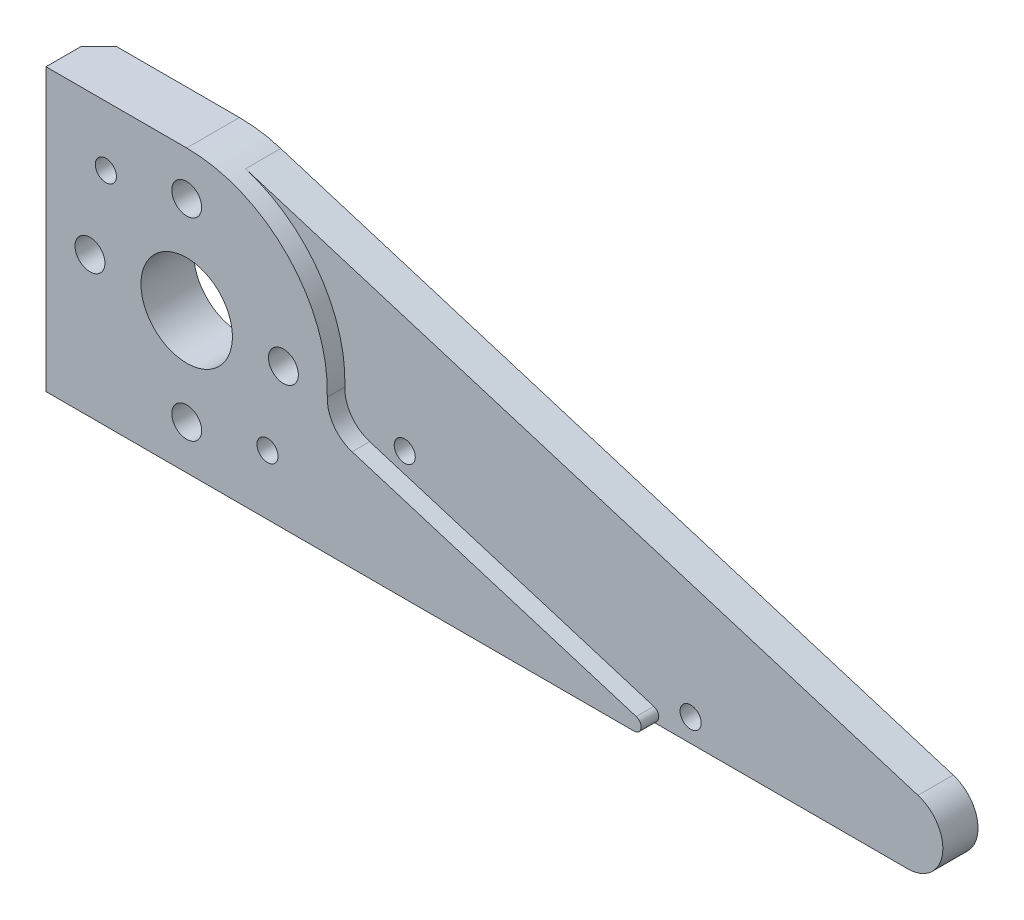
ISO-10303-21;
HEADER;
FILE_DESCRIPTION(('STEP AP214'),'2;1');
FILE_NAME('part.step','',(''),(''),'','','');
FILE_SCHEMA(('AUTOMOTIVE_DESIGN { 1 0 10303 214 1 1 1 1 }'));
ENDSEC;
DATA;
#1=APPLICATION_CONTEXT('core data for automotive mechanical design processes');
#2=APPLICATION_PROTOCOL_DEFINITION('international standard','automotive_design',2000,#1);
#3=PRODUCT_CONTEXT('',#1,'mechanical');
#4=PRODUCT('Part','Part','',(#3));
#5=PRODUCT_RELATED_PRODUCT_CATEGORY('part','',(#4));
#6=PRODUCT_DEFINITION_FORMATION('','',#4);
#7=PRODUCT_DEFINITION_CONTEXT('part definition',#1,'design');
#8=PRODUCT_DEFINITION('design','',#6,#7);
#9=PRODUCT_DEFINITION_SHAPE('','',#8);
#10=(LENGTH_UNIT() NAMED_UNIT(*) SI_UNIT(.MILLI.,.METRE.));
#11=(NAMED_UNIT(*) PLANE_ANGLE_UNIT() SI_UNIT($,.RADIAN.));
#12=(NAMED_UNIT(*) SI_UNIT($,.STERADIAN.) SOLID_ANGLE_UNIT());
#13=UNCERTAINTY_MEASURE_WITH_UNIT(LENGTH_MEASURE(1.E-05),#10,'distance_accuracy_value','');
#14=(GEOMETRIC_REPRESENTATION_CONTEXT(3) GLOBAL_UNCERTAINTY_ASSIGNED_CONTEXT((#13)) GLOBAL_UNIT_ASSIGNED_CONTEXT((#10,
#11,#12)) REPRESENTATION_CONTEXT('',''));
#15=CARTESIAN_POINT('',(0.,0.,0.));
#16=DIRECTION('',(0.,0.,1.));
#17=DIRECTION('',(1.,0.,0.));
#18=AXIS2_PLACEMENT_3D('',#15,#16,#17);
#19=CARTESIAN_POINT('',(200.,-30.,0.));
#20=DIRECTION('',(0.,0.,1.));
#21=DIRECTION('',(1.,0.,0.));
#22=AXIS2_PLACEMENT_3D('',#19,#20,#21);
#23=CYLINDRICAL_SURFACE('',#22,9.99999999999999);
#24=DIRECTION('',(0.,0.,1.));
#25=VECTOR('',#24,1.);
#26=CARTESIAN_POINT('',(202.933985330073,-20.440097799511,0.));
#27=LINE('',#26,#25);
#28=CARTESIAN_POINT('',(202.933985330073,-20.440097799511,0.));
#29=VERTEX_POINT('',#28);
#30=CARTESIAN_POINT('',(202.933985330073,-20.440097799511,10.));
#31=VERTEX_POINT('',#30);
#32=EDGE_CURVE('E143',#29,#31,#27,.T.);
#33=ORIENTED_EDGE('',*,*,#32,.T.);
#34=CARTESIAN_POINT('',(200.,-30.,10.));
#35=DIRECTION('',(0.,0.,1.));
#36=DIRECTION('',(1.,0.,0.));
#37=AXIS2_PLACEMENT_3D('',#34,#35,#36);
#38=CIRCLE('',#37,9.99999999999999);
#39=CARTESIAN_POINT('',(200.,-40.,10.));
#40=VERTEX_POINT('',#39);
#41=EDGE_CURVE('E135',#40,#31,#38,.T.);
#42=ORIENTED_EDGE('',*,*,#41,.F.);
#43=DIRECTION('',(0.,0.,1.));
#44=VECTOR('',#43,1.);
#45=CARTESIAN_POINT('',(200.,-40.,0.));
#46=LINE('',#45,#44);
#47=CARTESIAN_POINT('',(200.,-40.,0.));
#48=VERTEX_POINT('',#47);
#49=EDGE_CURVE('E142',#48,#40,#46,.T.);
#50=ORIENTED_EDGE('',*,*,#49,.F.);
#51=CARTESIAN_POINT('',(200.,-30.,0.));
#52=DIRECTION('',(0.,0.,1.));
#53=DIRECTION('',(1.,0.,0.));
#54=AXIS2_PLACEMENT_3D('',#51,#52,#53);
#55=CIRCLE('',#54,9.99999999999999);
#56=EDGE_CURVE('E299',#48,#29,#55,.T.);
#57=ORIENTED_EDGE('',*,*,#56,.T.);
#58=EDGE_LOOP('',(#33,#42,#50,#57));
#59=FACE_BOUND('',#58,.T.);
#60=ADVANCED_FACE('F34',(#59),#23,.T.);
#61=CARTESIAN_POINT('',(11.7359413202934,38.239608801956,0.));
#62=DIRECTION('',(0.293398533007335,0.9559902200489,0.));
#63=DIRECTION('',(-0.9559902200489,0.293398533007335,0.));
#64=AXIS2_PLACEMENT_3D('',#61,#62,#63);
#65=PLANE('',#64);
#66=DIRECTION('',(0.,0.,1.));
#67=VECTOR('',#66,1.);
#68=CARTESIAN_POINT('',(11.7359413202934,38.239608801956,0.));
#69=LINE('',#68,#67);
#70=CARTESIAN_POINT('',(11.7359413202934,38.239608801956,0.));
#71=VERTEX_POINT('',#70);
#72=CARTESIAN_POINT('',(11.7359413202934,38.239608801956,10.));
#73=VERTEX_POINT('',#72);
#74=EDGE_CURVE('E122',#71,#73,#69,.T.);
#75=ORIENTED_EDGE('',*,*,#74,.T.);
#76=DIRECTION('',(-0.9559902200489,0.293398533007335,0.));
#77=VECTOR('',#76,1.);
#78=CARTESIAN_POINT('',(11.7359413202934,38.239608801956,10.));
#79=LINE('',#78,#77);
#80=EDGE_CURVE('E130',#31,#73,#79,.T.);
#81=ORIENTED_EDGE('',*,*,#80,.F.);
#82=ORIENTED_EDGE('',*,*,#32,.F.);
#83=DIRECTION('',(-0.9559902200489,0.293398533007335,0.));
#84=VECTOR('',#83,1.);
#85=CARTESIAN_POINT('',(11.7359413202934,38.239608801956,0.));
#86=LINE('',#85,#84);
#87=EDGE_CURVE('E141',#29,#71,#86,.T.);
#88=ORIENTED_EDGE('',*,*,#87,.T.);
#89=EDGE_LOOP('',(#75,#81,#82,#88));
#90=FACE_BOUND('',#89,.T.);
#91=ADVANCED_FACE('F139',(#90),#65,.T.);
#92=CARTESIAN_POINT('',(0.,-27.4999999999983,20.));
#93=DIRECTION('',(0.,0.,-1.));
#94=DIRECTION('',(-1.,0.,0.));
#95=AXIS2_PLACEMENT_3D('',#92,#93,#94);
#96=CYLINDRICAL_SURFACE('',#95,2.49999999999872);
#97=CARTESIAN_POINT('',(0.,-27.4999999999983,0.));
#98=DIRECTION('',(0.,0.,-1.));
#99=DIRECTION('',(-1.,0.,0.));
#100=AXIS2_PLACEMENT_3D('',#97,#98,#99);
#101=CIRCLE('',#100,2.49999999999872);
#102=CARTESIAN_POINT('',(-2.49999999999873,-27.4999999999983,0.));
#103=VERTEX_POINT('',#102);
#104=EDGE_CURVE('E184',#103,#103,#101,.T.);
#105=ORIENTED_EDGE('',*,*,#104,.T.);
#106=EDGE_LOOP('',(#105));
#107=FACE_BOUND('',#106,.T.);
#108=CARTESIAN_POINT('',(0.,-27.4999999999983,9.));
#109=DIRECTION('',(0.,0.,1.));
#110=DIRECTION('',(1.,0.,0.));
#111=AXIS2_PLACEMENT_3D('',#108,#109,#110);
#112=CIRCLE('',#111,2.49999999999872);
#113=CARTESIAN_POINT('',(2.49999999999872,-27.4999999999983,9.));
#114=VERTEX_POINT('',#113);
#115=EDGE_CURVE('E154',#114,#114,#112,.F.);
#116=ORIENTED_EDGE('',*,*,#115,.F.);
#117=EDGE_LOOP('',(#116));
#118=FACE_BOUND('',#117,.T.);
#119=ADVANCED_FACE('F337',(#107,#118),#96,.F.);
#120=CARTESIAN_POINT('',(27.4999999999983,0.,20.));
#121=DIRECTION('',(0.,0.,-1.));
#122=DIRECTION('',(-1.,0.,0.));
#123=AXIS2_PLACEMENT_3D('',#120,#121,#122);
#124=CYLINDRICAL_SURFACE('',#123,2.49999999999705);
#125=CARTESIAN_POINT('',(27.4999999999983,0.,0.));
#126=DIRECTION('',(0.,0.,-1.));
#127=DIRECTION('',(-1.,0.,0.));
#128=AXIS2_PLACEMENT_3D('',#125,#126,#127);
#129=CIRCLE('',#128,2.49999999999705);
#130=CARTESIAN_POINT('',(25.0000000000013,0.,0.));
#131=VERTEX_POINT('',#130);
#132=EDGE_CURVE('E181',#131,#131,#129,.T.);
#133=ORIENTED_EDGE('',*,*,#132,.T.);
#134=EDGE_LOOP('',(#133));
#135=FACE_BOUND('',#134,.T.);
#136=CARTESIAN_POINT('',(27.4999999999983,0.,9.));
#137=DIRECTION('',(0.,0.,1.));
#138=DIRECTION('',(1.,0.,0.));
#139=AXIS2_PLACEMENT_3D('',#136,#137,#138);
#140=CIRCLE('',#139,2.49999999999705);
#141=CARTESIAN_POINT('',(29.9999999999954,0.,9.));
#142=VERTEX_POINT('',#141);
#143=EDGE_CURVE('E160',#142,#142,#140,.F.);
#144=ORIENTED_EDGE('',*,*,#143,.F.);
#145=EDGE_LOOP('',(#144));
#146=FACE_BOUND('',#145,.T.);
#147=ADVANCED_FACE('F380',(#135,#146),#124,.F.);
#148=CARTESIAN_POINT('',(-27.4999999999983,0.,20.));
#149=DIRECTION('',(0.,0.,-1.));
#150=DIRECTION('',(-1.,0.,0.));
#151=AXIS2_PLACEMENT_3D('',#148,#149,#150);
#152=CYLINDRICAL_SURFACE('',#151,2.49999999999999);
#153=CARTESIAN_POINT('',(-27.4999999999983,0.,0.));
#154=DIRECTION('',(0.,0.,-1.));
#155=DIRECTION('',(-1.,0.,0.));
#156=AXIS2_PLACEMENT_3D('',#153,#154,#155);
#157=CIRCLE('',#156,2.49999999999999);
#158=CARTESIAN_POINT('',(-29.9999999999983,0.,0.));
#159=VERTEX_POINT('',#158);
#160=EDGE_CURVE('E187',#159,#159,#157,.T.);
#161=ORIENTED_EDGE('',*,*,#160,.T.);
#162=EDGE_LOOP('',(#161));
#163=FACE_BOUND('',#162,.T.);
#164=CARTESIAN_POINT('',(-27.4999999999983,0.,9.));
#165=DIRECTION('',(0.,0.,1.));
#166=DIRECTION('',(1.,0.,0.));
#167=AXIS2_PLACEMENT_3D('',#164,#165,#166);
#168=CIRCLE('',#167,2.49999999999999);
#169=CARTESIAN_POINT('',(-24.9999999999983,0.,9.));
#170=VERTEX_POINT('',#169);
#171=EDGE_CURVE('E167',#170,#170,#168,.F.);
#172=ORIENTED_EDGE('',*,*,#171,.F.);
#173=EDGE_LOOP('',(#172));
#174=FACE_BOUND('',#173,.T.);
#175=ADVANCED_FACE('F378',(#163,#174),#152,.F.);
#176=CARTESIAN_POINT('',(2.18575157973078E-13,27.4999999999983,20.));
#177=DIRECTION('',(0.,0.,-1.));
#178=DIRECTION('',(-1.,0.,0.));
#179=AXIS2_PLACEMENT_3D('',#176,#177,#178);
#180=CYLINDRICAL_SURFACE('',#179,2.50000000000002);
#181=CARTESIAN_POINT('',(2.18575157973078E-13,27.4999999999983,0.));
#182=DIRECTION('',(0.,0.,-1.));
#183=DIRECTION('',(-1.,0.,0.));
#184=AXIS2_PLACEMENT_3D('',#181,#182,#183);
#185=CIRCLE('',#184,2.50000000000002);
#186=CARTESIAN_POINT('',(-2.4999999999998,27.4999999999983,0.));
#187=VERTEX_POINT('',#186);
#188=EDGE_CURVE('E178',#187,#187,#185,.T.);
#189=ORIENTED_EDGE('',*,*,#188,.T.);
#190=EDGE_LOOP('',(#189));
#191=FACE_BOUND('',#190,.T.);
#192=CARTESIAN_POINT('',(2.18575157973078E-13,27.4999999999983,9.));
#193=DIRECTION('',(0.,0.,1.));
#194=DIRECTION('',(1.,0.,0.));
#195=AXIS2_PLACEMENT_3D('',#192,#193,#194);
#196=CIRCLE('',#195,2.50000000000002);
#197=CARTESIAN_POINT('',(2.50000000000024,27.4999999999983,9.));
#198=VERTEX_POINT('',#197);
#199=EDGE_CURVE('E174',#198,#198,#196,.F.);
#200=ORIENTED_EDGE('',*,*,#199,.F.);
#201=EDGE_LOOP('',(#200));
#202=FACE_BOUND('',#201,.T.);
#203=ADVANCED_FACE('F375',(#191,#202),#180,.F.);
#204=CARTESIAN_POINT('',(0.,0.,0.));
#205=DIRECTION('',(0.,0.,1.));
#206=DIRECTION('',(1.,0.,0.));
#207=AXIS2_PLACEMENT_3D('',#204,#205,#206);
#208=PLANE('',#207);
#209=ORIENTED_EDGE('',*,*,#188,.F.);
#210=EDGE_LOOP('',(#209));
#211=FACE_BOUND('',#210,.T.);
#212=ORIENTED_EDGE('',*,*,#132,.F.);
#213=EDGE_LOOP('',(#212));
#214=FACE_BOUND('',#213,.T.);
#215=ORIENTED_EDGE('',*,*,#104,.F.);
#216=EDGE_LOOP('',(#215));
#217=FACE_BOUND('',#216,.T.);
#218=ORIENTED_EDGE('',*,*,#160,.F.);
#219=EDGE_LOOP('',(#218));
#220=FACE_BOUND('',#219,.T.);
#221=CARTESIAN_POINT('',(-22.9809703885628,22.9809703885628,0.));
#222=DIRECTION('',(0.,0.,1.));
#223=DIRECTION('',(1.,0.,0.));
#224=AXIS2_PLACEMENT_3D('',#221,#222,#223);
#225=CIRCLE('',#224,5.25);
#226=CARTESIAN_POINT('',(-17.7309703885628,22.9809703885628,0.));
#227=VERTEX_POINT('',#226);
#228=EDGE_CURVE('E201',#227,#227,#225,.T.);
#229=ORIENTED_EDGE('',*,*,#228,.T.);
#230=EDGE_LOOP('',(#229));
#231=FACE_BOUND('',#230,.T.);
#232=CARTESIAN_POINT('',(0.,0.,0.));
#233=DIRECTION('',(0.,0.,-1.));
#234=DIRECTION('',(-1.,0.,0.));
#235=AXIS2_PLACEMENT_3D('',#232,#233,#234);
#236=CIRCLE('',#235,13.);
#237=CARTESIAN_POINT('',(-13.,0.,0.));
#238=VERTEX_POINT('',#237);
#239=EDGE_CURVE('E210',#238,#238,#236,.T.);
#240=ORIENTED_EDGE('',*,*,#239,.F.);
#241=EDGE_LOOP('',(#240));
#242=FACE_BOUND('',#241,.T.);
#243=DIRECTION('',(1.,0.,0.));
#244=VECTOR('',#243,1.);
#245=CARTESIAN_POINT('',(-40.,-40.,0.));
#246=LINE('',#245,#244);
#247=CARTESIAN_POINT('',(-35.,-40.,0.));
#248=VERTEX_POINT('',#247);
#249=EDGE_CURVE('E214',#248,#48,#246,.T.);
#250=ORIENTED_EDGE('',*,*,#249,.F.);
#251=DIRECTION('',(0.,1.,0.));
#252=VECTOR('',#251,1.);
#253=CARTESIAN_POINT('',(-35.,0.,0.));
#254=LINE('',#253,#252);
#255=CARTESIAN_POINT('',(-35.,40.,0.));
#256=VERTEX_POINT('',#255);
#257=EDGE_CURVE('E246',#248,#256,#254,.T.);
#258=ORIENTED_EDGE('',*,*,#257,.T.);
#259=DIRECTION('',(-1.,0.,0.));
#260=VECTOR('',#259,1.);
#261=CARTESIAN_POINT('',(-40.,40.,0.));
#262=LINE('',#261,#260);
#263=CARTESIAN_POINT('',(0.,40.,0.));
#264=VERTEX_POINT('',#263);
#265=EDGE_CURVE('E221',#264,#256,#262,.T.);
#266=ORIENTED_EDGE('',*,*,#265,.F.);
#267=CARTESIAN_POINT('',(0.,0.,0.));
#268=DIRECTION('',(0.,0.,1.));
#269=DIRECTION('',(1.,0.,0.));
#270=AXIS2_PLACEMENT_3D('',#267,#268,#269);
#271=CIRCLE('',#270,40.);
#272=EDGE_CURVE('E229',#71,#264,#271,.T.);
#273=ORIENTED_EDGE('',*,*,#272,.F.);
#274=ORIENTED_EDGE('',*,*,#87,.F.);
#275=ORIENTED_EDGE('',*,*,#56,.F.);
#276=EDGE_LOOP('',(#250,#258,#266,#273,#274,#275));
#277=FACE_BOUND('',#276,.T.);
#278=CARTESIAN_POINT('',(22.9809703885627,-22.9809703885628,0.));
#279=DIRECTION('',(0.,0.,1.));
#280=DIRECTION('',(-1.,0.,0.));
#281=AXIS2_PLACEMENT_3D('',#278,#279,#280);
#282=CIRCLE('',#281,5.25);
#283=CARTESIAN_POINT('',(17.7309703885627,-22.9809703885628,0.));
#284=VERTEX_POINT('',#283);
#285=EDGE_CURVE('E190',#284,#284,#282,.T.);
#286=ORIENTED_EDGE('',*,*,#285,.T.);
#287=EDGE_LOOP('',(#286));
#288=FACE_BOUND('',#287,.T.);
#289=ADVANCED_FACE('F295',(#211,#214,#217,#220,#231,#242,#277,#288),#208,.F.);
#290=CARTESIAN_POINT('',(22.9809703885627,-22.9809703885628,-5.));
#291=DIRECTION('',(0.,0.,1.));
#292=DIRECTION('',(1.,0.,0.));
#293=AXIS2_PLACEMENT_3D('',#290,#291,#292);
#294=CYLINDRICAL_SURFACE('',#293,3.);
#295=CARTESIAN_POINT('',(22.9809703885627,-22.9809703885628,15.));
#296=DIRECTION('',(0.,0.,1.));
#297=DIRECTION('',(1.,0.,0.));
#298=AXIS2_PLACEMENT_3D('',#295,#296,#297);
#299=CIRCLE('',#298,3.);
#300=CARTESIAN_POINT('',(25.9809703885627,-22.9809703885628,15.));
#301=VERTEX_POINT('',#300);
#302=EDGE_CURVE('E204',#301,#301,#299,.T.);
#303=ORIENTED_EDGE('',*,*,#302,.T.);
#304=EDGE_LOOP('',(#303));
#305=FACE_BOUND('',#304,.T.);
#306=CARTESIAN_POINT('',(22.9809703885627,-22.9809703885628,8.5));
#307=DIRECTION('',(0.,0.,-1.));
#308=DIRECTION('',(-1.,0.,0.));
#309=AXIS2_PLACEMENT_3D('',#306,#307,#308);
#310=CIRCLE('',#309,3.);
#311=CARTESIAN_POINT('',(19.9809703885627,-22.9809703885628,8.5));
#312=VERTEX_POINT('',#311);
#313=EDGE_CURVE('E194',#312,#312,#310,.F.);
#314=ORIENTED_EDGE('',*,*,#313,.F.);
#315=EDGE_LOOP('',(#314));
#316=FACE_BOUND('',#315,.T.);
#317=ADVANCED_FACE('F406',(#305,#316),#294,.F.);
#318=CARTESIAN_POINT('',(-40.,40.,15.));
#319=DIRECTION('',(1.,0.,0.));
#320=DIRECTION('',(0.,1.,0.));
#321=AXIS2_PLACEMENT_3D('',#318,#319,#320);
#322=PLANE('',#321);
#323=DIRECTION('',(0.,0.,-1.));
#324=VECTOR('',#323,1.);
#325=CARTESIAN_POINT('',(-40.,40.,15.));
#326=LINE('',#325,#324);
#327=CARTESIAN_POINT('',(-40.,40.,15.));
#328=VERTEX_POINT('',#327);
#329=CARTESIAN_POINT('',(-40.,40.,4.99999999999999));
#330=VERTEX_POINT('',#329);
#331=EDGE_CURVE('E227',#328,#330,#326,.T.);
#332=ORIENTED_EDGE('',*,*,#331,.T.);
#333=DIRECTION('',(0.,-1.,0.));
#334=VECTOR('',#333,1.);
#335=CARTESIAN_POINT('',(-40.,40.,4.99999999999999));
#336=LINE('',#335,#334);
#337=CARTESIAN_POINT('',(-40.,-40.,4.99999999999999));
#338=VERTEX_POINT('',#337);
#339=EDGE_CURVE('E241',#330,#338,#336,.T.);
#340=ORIENTED_EDGE('',*,*,#339,.T.);
#341=DIRECTION('',(0.,0.,-1.));
#342=VECTOR('',#341,1.);
#343=CARTESIAN_POINT('',(-40.,-40.,15.));
#344=LINE('',#343,#342);
#345=CARTESIAN_POINT('',(-40.,-40.,15.));
#346=VERTEX_POINT('',#345);
#347=EDGE_CURVE('E238',#346,#338,#344,.T.);
#348=ORIENTED_EDGE('',*,*,#347,.F.);
#349=DIRECTION('',(0.,-1.,0.));
#350=VECTOR('',#349,1.);
#351=CARTESIAN_POINT('',(-40.,40.,15.));
#352=LINE('',#351,#350);
#353=EDGE_CURVE('E217',#328,#346,#352,.T.);
#354=ORIENTED_EDGE('',*,*,#353,.F.);
#355=EDGE_LOOP('',(#332,#340,#348,#354));
#356=FACE_BOUND('',#355,.T.);
#357=ADVANCED_FACE('F287',(#356),#322,.F.);
#358=CARTESIAN_POINT('',(-40.,-40.,15.));
#359=DIRECTION('',(0.,1.,0.));
#360=DIRECTION('',(0.,0.,1.));
#361=AXIS2_PLACEMENT_3D('',#358,#359,#360);
#362=PLANE('',#361);
#363=DIRECTION('',(1.,0.,0.));
#364=VECTOR('',#363,1.);
#365=CARTESIAN_POINT('',(140.558333333333,-40.,10.));
#366=LINE('',#365,#364);
#367=CARTESIAN_POINT('',(127.225,-40.,10.));
#368=VERTEX_POINT('',#367);
#369=EDGE_CURVE('E277',#368,#40,#366,.T.);
#370=ORIENTED_EDGE('',*,*,#369,.F.);
#371=DIRECTION('',(0.,0.,1.));
#372=VECTOR('',#371,1.);
#373=CARTESIAN_POINT('',(127.225,-40.,15.));
#374=LINE('',#373,#372);
#375=CARTESIAN_POINT('',(127.225,-40.,15.));
#376=VERTEX_POINT('',#375);
#377=EDGE_CURVE('E250',#368,#376,#374,.T.);
#378=ORIENTED_EDGE('',*,*,#377,.T.);
#379=DIRECTION('',(1.,0.,0.));
#380=VECTOR('',#379,1.);
#381=CARTESIAN_POINT('',(-40.,-40.,15.));
#382=LINE('',#381,#380);
#383=EDGE_CURVE('E220',#346,#376,#382,.T.);
#384=ORIENTED_EDGE('',*,*,#383,.F.);
#385=ORIENTED_EDGE('',*,*,#347,.T.);
#386=DIRECTION('',(-0.70710678118655,0.,0.707106781186546));
#387=VECTOR('',#386,1.);
#388=CARTESIAN_POINT('',(-40.,-40.,5.));
#389=LINE('',#388,#387);
#390=EDGE_CURVE('E244',#338,#248,#389,.F.);
#391=ORIENTED_EDGE('',*,*,#390,.T.);
#392=ORIENTED_EDGE('',*,*,#249,.T.);
#393=ORIENTED_EDGE('',*,*,#49,.T.);
#394=EDGE_LOOP('',(#370,#378,#384,#385,#391,#392,#393));
#395=FACE_BOUND('',#394,.T.);
#396=ADVANCED_FACE('F276',(#395),#362,.F.);
#397=CARTESIAN_POINT('',(0.,0.,15.));
#398=DIRECTION('',(0.,0.,-1.));
#399=DIRECTION('',(-1.,0.,0.));
#400=AXIS2_PLACEMENT_3D('',#397,#398,#399);
#401=CYLINDRICAL_SURFACE('',#400,40.);
#402=CARTESIAN_POINT('',(0.,0.,15.));
#403=DIRECTION('',(0.,0.,1.));
#404=DIRECTION('',(1.,0.,0.));
#405=AXIS2_PLACEMENT_3D('',#402,#403,#404);
#406=CIRCLE('',#405,40.);
#407=CARTESIAN_POINT('',(39.975840488905,-1.39002777153095,15.));
#408=VERTEX_POINT('',#407);
#409=CARTESIAN_POINT('',(0.,40.,15.));
#410=VERTEX_POINT('',#409);
#411=EDGE_CURVE('E223',#408,#410,#406,.T.);
#412=ORIENTED_EDGE('',*,*,#411,.F.);
#413=DIRECTION('',(0.,0.,1.));
#414=VECTOR('',#413,1.);
#415=CARTESIAN_POINT('',(39.975840488905,-1.39002777153095,10.));
#416=LINE('',#415,#414);
#417=CARTESIAN_POINT('',(39.975840488905,-1.39002777153095,10.));
#418=VERTEX_POINT('',#417);
#419=EDGE_CURVE('E125',#418,#408,#416,.T.);
#420=ORIENTED_EDGE('',*,*,#419,.F.);
#421=CARTESIAN_POINT('',(0.,0.,10.));
#422=DIRECTION('',(0.,0.,-1.));
#423=DIRECTION('',(1.,0.,0.));
#424=AXIS2_PLACEMENT_3D('',#421,#422,#423);
#425=CIRCLE('',#424,40.);
#426=EDGE_CURVE('E118',#73,#418,#425,.T.);
#427=ORIENTED_EDGE('',*,*,#426,.F.);
#428=ORIENTED_EDGE('',*,*,#74,.F.);
#429=ORIENTED_EDGE('',*,*,#272,.T.);
#430=DIRECTION('',(0.,0.,-1.));
#431=VECTOR('',#430,1.);
#432=CARTESIAN_POINT('',(0.,40.,15.));
#433=LINE('',#432,#431);
#434=EDGE_CURVE('E235',#410,#264,#433,.T.);
#435=ORIENTED_EDGE('',*,*,#434,.F.);
#436=EDGE_LOOP('',(#412,#420,#427,#428,#429,#435));
#437=FACE_BOUND('',#436,.T.);
#438=ADVANCED_FACE('F120',(#437),#401,.T.);
#439=CARTESIAN_POINT('',(-40.,40.,15.));
#440=DIRECTION('',(0.,-1.,0.));
#441=DIRECTION('',(1.,0.,0.));
#442=AXIS2_PLACEMENT_3D('',#439,#440,#441);
#443=PLANE('',#442);
#444=ORIENTED_EDGE('',*,*,#265,.T.);
#445=DIRECTION('',(0.70710678118655,0.,-0.707106781186546));
#446=VECTOR('',#445,1.);
#447=CARTESIAN_POINT('',(-40.,40.,4.99999999999999));
#448=LINE('',#447,#446);
#449=EDGE_CURVE('E248',#256,#330,#448,.F.);
#450=ORIENTED_EDGE('',*,*,#449,.T.);
#451=ORIENTED_EDGE('',*,*,#331,.F.);
#452=DIRECTION('',(-1.,0.,0.));
#453=VECTOR('',#452,1.);
#454=CARTESIAN_POINT('',(-40.,40.,15.));
#455=LINE('',#454,#453);
#456=EDGE_CURVE('E225',#410,#328,#455,.T.);
#457=ORIENTED_EDGE('',*,*,#456,.F.);
#458=ORIENTED_EDGE('',*,*,#434,.T.);
#459=EDGE_LOOP('',(#444,#450,#451,#457,#458));
#460=FACE_BOUND('',#459,.T.);
#461=ADVANCED_FACE('F303',(#460),#443,.F.);
#462=CARTESIAN_POINT('',(0.,0.,15.));
#463=DIRECTION('',(0.,0.,1.));
#464=DIRECTION('',(1.,0.,0.));
#465=AXIS2_PLACEMENT_3D('',#462,#463,#464);
#466=PLANE('',#465);
#467=ORIENTED_EDGE('',*,*,#383,.T.);
#468=CARTESIAN_POINT('',(127.225,-38.,15.));
#469=DIRECTION('',(0.,0.,1.));
#470=DIRECTION('',(1.,0.,0.));
#471=AXIS2_PLACEMENT_3D('',#468,#469,#470);
#472=CIRCLE('',#471,2.);
#473=CARTESIAN_POINT('',(127.811797066015,-36.0880195599022,15.));
#474=VERTEX_POINT('',#473);
#475=EDGE_CURVE('E56',#376,#474,#472,.T.);
#476=ORIENTED_EDGE('',*,*,#475,.T.);
#477=DIRECTION('',(0.9559902200489,-0.293398533007335,0.));
#478=VECTOR('',#477,1.);
#479=CARTESIAN_POINT('',(140.558333333333,-40.,15.));
#480=LINE('',#479,#478);
#481=CARTESIAN_POINT('',(47.0358152810579,-11.2974369149027,15.));
#482=VERTEX_POINT('',#481);
#483=EDGE_CURVE('E311',#482,#474,#480,.T.);
#484=ORIENTED_EDGE('',*,*,#483,.F.);
#485=CARTESIAN_POINT('',(49.9698006111312,-1.73753471441369,15.));
#486=DIRECTION('',(0.,0.,1.));
#487=DIRECTION('',(-1.,0.,0.));
#488=AXIS2_PLACEMENT_3D('',#485,#486,#487);
#489=CIRCLE('',#488,10.);
#490=EDGE_CURVE('E266',#408,#482,#489,.T.);
#491=ORIENTED_EDGE('',*,*,#490,.F.);
#492=ORIENTED_EDGE('',*,*,#411,.T.);
#493=ORIENTED_EDGE('',*,*,#456,.T.);
#494=ORIENTED_EDGE('',*,*,#353,.T.);
#495=EDGE_LOOP('',(#467,#476,#484,#491,#492,#493,#494));
#496=FACE_BOUND('',#495,.T.);
#497=CARTESIAN_POINT('',(0.,-27.4999999999983,15.));
#498=DIRECTION('',(0.,0.,1.));
#499=DIRECTION('',(1.,0.,0.));
#500=AXIS2_PLACEMENT_3D('',#497,#498,#499);
#501=CIRCLE('',#500,4.24999999999928);
#502=CARTESIAN_POINT('',(4.24999999999927,-27.4999999999983,15.));
#503=VERTEX_POINT('',#502);
#504=EDGE_CURVE('E146',#503,#503,#501,.T.);
#505=ORIENTED_EDGE('',*,*,#504,.F.);
#506=EDGE_LOOP('',(#505));
#507=FACE_BOUND('',#506,.T.);
#508=CARTESIAN_POINT('',(27.4999999999983,0.,15.));
#509=DIRECTION('',(0.,0.,1.));
#510=DIRECTION('',(1.,0.,0.));
#511=AXIS2_PLACEMENT_3D('',#508,#509,#510);
#512=CIRCLE('',#511,4.25000000000077);
#513=CARTESIAN_POINT('',(31.7499999999991,0.,15.));
#514=VERTEX_POINT('',#513);
#515=EDGE_CURVE('E161',#514,#514,#512,.T.);
#516=ORIENTED_EDGE('',*,*,#515,.F.);
#517=EDGE_LOOP('',(#516));
#518=FACE_BOUND('',#517,.T.);
#519=CARTESIAN_POINT('',(-27.4999999999983,0.,15.));
#520=DIRECTION('',(0.,0.,1.));
#521=DIRECTION('',(1.,0.,0.));
#522=AXIS2_PLACEMENT_3D('',#519,#520,#521);
#523=CIRCLE('',#522,4.24999999999899);
#524=CARTESIAN_POINT('',(-23.2499999999993,0.,15.));
#525=VERTEX_POINT('',#524);
#526=EDGE_CURVE('E168',#525,#525,#523,.T.);
#527=ORIENTED_EDGE('',*,*,#526,.F.);
#528=EDGE_LOOP('',(#527));
#529=FACE_BOUND('',#528,.T.);
#530=CARTESIAN_POINT('',(2.18681409785981E-13,27.4999999999983,15.));
#531=DIRECTION('',(0.,0.,1.));
#532=DIRECTION('',(1.,0.,0.));
#533=AXIS2_PLACEMENT_3D('',#530,#531,#532);
#534=CIRCLE('',#533,4.25);
#535=CARTESIAN_POINT('',(4.25000000000022,27.4999999999983,15.));
#536=VERTEX_POINT('',#535);
#537=EDGE_CURVE('E175',#536,#536,#534,.T.);
#538=ORIENTED_EDGE('',*,*,#537,.F.);
#539=EDGE_LOOP('',(#538));
#540=FACE_BOUND('',#539,.T.);
#541=ORIENTED_EDGE('',*,*,#302,.F.);
#542=EDGE_LOOP('',(#541));
#543=FACE_BOUND('',#542,.T.);
#544=CARTESIAN_POINT('',(-22.9809703885628,22.9809703885628,15.));
#545=DIRECTION('',(0.,0.,1.));
#546=DIRECTION('',(1.,0.,0.));
#547=AXIS2_PLACEMENT_3D('',#544,#545,#546);
#548=CIRCLE('',#547,3.);
#549=CARTESIAN_POINT('',(-19.9809703885628,22.9809703885628,15.));
#550=VERTEX_POINT('',#549);
#551=EDGE_CURVE('E207',#550,#550,#548,.T.);
#552=ORIENTED_EDGE('',*,*,#551,.F.);
#553=EDGE_LOOP('',(#552));
#554=FACE_BOUND('',#553,.T.);
#555=CARTESIAN_POINT('',(0.,0.,15.));
#556=DIRECTION('',(0.,0.,-1.));
#557=DIRECTION('',(-1.,0.,0.));
#558=AXIS2_PLACEMENT_3D('',#555,#556,#557);
#559=CIRCLE('',#558,13.);
#560=CARTESIAN_POINT('',(-13.,0.,15.));
#561=VERTEX_POINT('',#560);
#562=EDGE_CURVE('E211',#561,#561,#559,.T.);
#563=ORIENTED_EDGE('',*,*,#562,.T.);
#564=EDGE_LOOP('',(#563));
#565=FACE_BOUND('',#564,.T.);
#566=ADVANCED_FACE('F280',(#496,#507,#518,#529,#540,#543,#554,#565),#466,.T.);
#567=CARTESIAN_POINT('',(-40.,40.,4.99999999999999));
#568=DIRECTION('',(0.707106781186545,0.,0.707106781186549));
#569=DIRECTION('',(0.70710678118655,0.,-0.707106781186546));
#570=AXIS2_PLACEMENT_3D('',#567,#568,#569);
#571=PLANE('',#570);
#572=ORIENTED_EDGE('',*,*,#449,.F.);
#573=ORIENTED_EDGE('',*,*,#257,.F.);
#574=ORIENTED_EDGE('',*,*,#390,.F.);
#575=ORIENTED_EDGE('',*,*,#339,.F.);
#576=EDGE_LOOP('',(#572,#573,#574,#575));
#577=FACE_BOUND('',#576,.T.);
#578=ADVANCED_FACE('F301',(#577),#571,.F.);
#579=CARTESIAN_POINT('',(0.,0.,15.));
#580=DIRECTION('',(0.,0.,-1.));
#581=DIRECTION('',(-1.,0.,0.));
#582=AXIS2_PLACEMENT_3D('',#579,#580,#581);
#583=CYLINDRICAL_SURFACE('',#582,13.);
#584=ORIENTED_EDGE('',*,*,#562,.F.);
#585=EDGE_LOOP('',(#584));
#586=FACE_BOUND('',#585,.T.);
#587=ORIENTED_EDGE('',*,*,#239,.T.);
#588=EDGE_LOOP('',(#587));
#589=FACE_BOUND('',#588,.T.);
#590=ADVANCED_FACE('F412',(#586,#589),#583,.F.);
#591=CARTESIAN_POINT('',(-22.9809703885628,22.9809703885628,-5.));
#592=DIRECTION('',(0.,0.,1.));
#593=DIRECTION('',(1.,0.,0.));
#594=AXIS2_PLACEMENT_3D('',#591,#592,#593);
#595=CYLINDRICAL_SURFACE('',#594,3.);
#596=CARTESIAN_POINT('',(-22.9809703885628,22.9809703885628,8.5));
#597=DIRECTION('',(0.,0.,1.));
#598=DIRECTION('',(1.,0.,0.));
#599=AXIS2_PLACEMENT_3D('',#596,#597,#598);
#600=CIRCLE('',#599,3.);
#601=CARTESIAN_POINT('',(-19.9809703885628,22.9809703885628,8.5));
#602=VERTEX_POINT('',#601);
#603=EDGE_CURVE('E200',#602,#602,#600,.F.);
#604=ORIENTED_EDGE('',*,*,#603,.T.);
#605=EDGE_LOOP('',(#604));
#606=FACE_BOUND('',#605,.T.);
#607=ORIENTED_EDGE('',*,*,#551,.T.);
#608=EDGE_LOOP('',(#607));
#609=FACE_BOUND('',#608,.T.);
#610=ADVANCED_FACE('F401',(#606,#609),#595,.F.);
#611=CARTESIAN_POINT('',(-22.9809703885628,22.9809703885628,8.5));
#612=DIRECTION('',(0.,0.,1.));
#613=DIRECTION('',(1.,0.,0.));
#614=AXIS2_PLACEMENT_3D('',#611,#612,#613);
#615=PLANE('',#614);
#616=CARTESIAN_POINT('',(-22.9809703885628,22.9809703885628,8.5));
#617=DIRECTION('',(0.,0.,1.));
#618=DIRECTION('',(1.,0.,0.));
#619=AXIS2_PLACEMENT_3D('',#616,#617,#618);
#620=CIRCLE('',#619,5.25);
#621=CARTESIAN_POINT('',(-17.7309703885628,22.9809703885628,8.5));
#622=VERTEX_POINT('',#621);
#623=EDGE_CURVE('E197',#622,#622,#620,.T.);
#624=ORIENTED_EDGE('',*,*,#623,.F.);
#625=EDGE_LOOP('',(#624));
#626=FACE_BOUND('',#625,.T.);
#627=ORIENTED_EDGE('',*,*,#603,.F.);
#628=EDGE_LOOP('',(#627));
#629=FACE_BOUND('',#628,.T.);
#630=ADVANCED_FACE('F398',(#626,#629),#615,.F.);
#631=CARTESIAN_POINT('',(-22.9809703885628,22.9809703885628,8.5));
#632=DIRECTION('',(0.,0.,-1.));
#633=DIRECTION('',(-1.,0.,0.));
#634=AXIS2_PLACEMENT_3D('',#631,#632,#633);
#635=CYLINDRICAL_SURFACE('',#634,5.25);
#636=ORIENTED_EDGE('',*,*,#623,.T.);
#637=EDGE_LOOP('',(#636));
#638=FACE_BOUND('',#637,.T.);
#639=ORIENTED_EDGE('',*,*,#228,.F.);
#640=EDGE_LOOP('',(#639));
#641=FACE_BOUND('',#640,.T.);
#642=ADVANCED_FACE('F393',(#638,#641),#635,.F.);
#643=CARTESIAN_POINT('',(22.9809703885627,-22.9809703885628,8.5));
#644=DIRECTION('',(0.,0.,-1.));
#645=DIRECTION('',(-1.,0.,0.));
#646=AXIS2_PLACEMENT_3D('',#643,#644,#645);
#647=PLANE('',#646);
#648=CARTESIAN_POINT('',(22.9809703885627,-22.9809703885628,8.5));
#649=DIRECTION('',(0.,0.,1.));
#650=DIRECTION('',(-1.,0.,0.));
#651=AXIS2_PLACEMENT_3D('',#648,#649,#650);
#652=CIRCLE('',#651,5.25);
#653=CARTESIAN_POINT('',(17.7309703885627,-22.9809703885628,8.5));
#654=VERTEX_POINT('',#653);
#655=EDGE_CURVE('E191',#654,#654,#652,.T.);
#656=ORIENTED_EDGE('',*,*,#655,.F.);
#657=EDGE_LOOP('',(#656));
#658=FACE_BOUND('',#657,.T.);
#659=ORIENTED_EDGE('',*,*,#313,.T.);
#660=EDGE_LOOP('',(#659));
#661=FACE_BOUND('',#660,.T.);
#662=ADVANCED_FACE('F390',(#658,#661),#647,.T.);
#663=CARTESIAN_POINT('',(22.9809703885627,-22.9809703885628,8.5));
#664=DIRECTION('',(0.,0.,-1.));
#665=DIRECTION('',(-1.,0.,0.));
#666=AXIS2_PLACEMENT_3D('',#663,#664,#665);
#667=CYLINDRICAL_SURFACE('',#666,5.25);
#668=ORIENTED_EDGE('',*,*,#655,.T.);
#669=EDGE_LOOP('',(#668));
#670=FACE_BOUND('',#669,.T.);
#671=ORIENTED_EDGE('',*,*,#285,.F.);
#672=EDGE_LOOP('',(#671));
#673=FACE_BOUND('',#672,.T.);
#674=ADVANCED_FACE('F370',(#670,#673),#667,.F.);
#675=CARTESIAN_POINT('',(2.18681409785981E-13,27.4999999999983,9.));
#676=DIRECTION('',(0.,0.,1.));
#677=DIRECTION('',(1.,0.,0.));
#678=AXIS2_PLACEMENT_3D('',#675,#676,#677);
#679=PLANE('',#678);
#680=CARTESIAN_POINT('',(2.18681409785981E-13,27.4999999999983,9.));
#681=DIRECTION('',(0.,0.,1.));
#682=DIRECTION('',(1.,0.,0.));
#683=AXIS2_PLACEMENT_3D('',#680,#681,#682);
#684=CIRCLE('',#683,4.25);
#685=CARTESIAN_POINT('',(4.25000000000022,27.4999999999983,9.));
#686=VERTEX_POINT('',#685);
#687=EDGE_CURVE('E171',#686,#686,#684,.T.);
#688=ORIENTED_EDGE('',*,*,#687,.T.);
#689=EDGE_LOOP('',(#688));
#690=FACE_BOUND('',#689,.T.);
#691=ORIENTED_EDGE('',*,*,#199,.T.);
#692=EDGE_LOOP('',(#691));
#693=FACE_BOUND('',#692,.T.);
#694=ADVANCED_FACE('F367',(#690,#693),#679,.T.);
#695=CARTESIAN_POINT('',(2.18681409785981E-13,27.4999999999983,9.));
#696=DIRECTION('',(0.,0.,1.));
#697=DIRECTION('',(1.,0.,0.));
#698=AXIS2_PLACEMENT_3D('',#695,#696,#697);
#699=CYLINDRICAL_SURFACE('',#698,4.25);
#700=ORIENTED_EDGE('',*,*,#687,.F.);
#701=EDGE_LOOP('',(#700));
#702=FACE_BOUND('',#701,.T.);
#703=ORIENTED_EDGE('',*,*,#537,.T.);
#704=EDGE_LOOP('',(#703));
#705=FACE_BOUND('',#704,.T.);
#706=ADVANCED_FACE('F362',(#702,#705),#699,.F.);
#707=CARTESIAN_POINT('',(-27.4999999999983,0.,9.));
#708=DIRECTION('',(0.,0.,1.));
#709=DIRECTION('',(1.,0.,0.));
#710=AXIS2_PLACEMENT_3D('',#707,#708,#709);
#711=PLANE('',#710);
#712=CARTESIAN_POINT('',(-27.4999999999983,0.,9.));
#713=DIRECTION('',(0.,0.,1.));
#714=DIRECTION('',(1.,0.,0.));
#715=AXIS2_PLACEMENT_3D('',#712,#713,#714);
#716=CIRCLE('',#715,4.24999999999899);
#717=CARTESIAN_POINT('',(-23.2499999999993,0.,9.));
#718=VERTEX_POINT('',#717);
#719=EDGE_CURVE('E164',#718,#718,#716,.T.);
#720=ORIENTED_EDGE('',*,*,#719,.T.);
#721=EDGE_LOOP('',(#720));
#722=FACE_BOUND('',#721,.T.);
#723=ORIENTED_EDGE('',*,*,#171,.T.);
#724=EDGE_LOOP('',(#723));
#725=FACE_BOUND('',#724,.T.);
#726=ADVANCED_FACE('F359',(#722,#725),#711,.T.);
#727=CARTESIAN_POINT('',(-27.4999999999983,0.,9.));
#728=DIRECTION('',(0.,0.,1.));
#729=DIRECTION('',(1.,0.,0.));
#730=AXIS2_PLACEMENT_3D('',#727,#728,#729);
#731=CYLINDRICAL_SURFACE('',#730,4.24999999999899);
#732=ORIENTED_EDGE('',*,*,#719,.F.);
#733=EDGE_LOOP('',(#732));
#734=FACE_BOUND('',#733,.T.);
#735=ORIENTED_EDGE('',*,*,#526,.T.);
#736=EDGE_LOOP('',(#735));
#737=FACE_BOUND('',#736,.T.);
#738=ADVANCED_FACE('F354',(#734,#737),#731,.F.);
#739=CARTESIAN_POINT('',(27.4999999999983,0.,9.));
#740=DIRECTION('',(0.,0.,1.));
#741=DIRECTION('',(1.,0.,0.));
#742=AXIS2_PLACEMENT_3D('',#739,#740,#741);
#743=PLANE('',#742);
#744=CARTESIAN_POINT('',(27.4999999999983,0.,9.));
#745=DIRECTION('',(0.,0.,1.));
#746=DIRECTION('',(1.,0.,0.));
#747=AXIS2_PLACEMENT_3D('',#744,#745,#746);
#748=CIRCLE('',#747,4.25000000000077);
#749=CARTESIAN_POINT('',(31.7499999999991,0.,9.));
#750=VERTEX_POINT('',#749);
#751=EDGE_CURVE('E157',#750,#750,#748,.T.);
#752=ORIENTED_EDGE('',*,*,#751,.T.);
#753=EDGE_LOOP('',(#752));
#754=FACE_BOUND('',#753,.T.);
#755=ORIENTED_EDGE('',*,*,#143,.T.);
#756=EDGE_LOOP('',(#755));
#757=FACE_BOUND('',#756,.T.);
#758=ADVANCED_FACE('F351',(#754,#757),#743,.T.);
#759=CARTESIAN_POINT('',(27.4999999999983,0.,9.));
#760=DIRECTION('',(0.,0.,1.));
#761=DIRECTION('',(1.,0.,0.));
#762=AXIS2_PLACEMENT_3D('',#759,#760,#761);
#763=CYLINDRICAL_SURFACE('',#762,4.25000000000077);
#764=ORIENTED_EDGE('',*,*,#751,.F.);
#765=EDGE_LOOP('',(#764));
#766=FACE_BOUND('',#765,.T.);
#767=ORIENTED_EDGE('',*,*,#515,.T.);
#768=EDGE_LOOP('',(#767));
#769=FACE_BOUND('',#768,.T.);
#770=ADVANCED_FACE('F345',(#766,#769),#763,.F.);
#771=CARTESIAN_POINT('',(0.,-27.4999999999983,9.));
#772=DIRECTION('',(0.,0.,1.));
#773=DIRECTION('',(1.,0.,0.));
#774=AXIS2_PLACEMENT_3D('',#771,#772,#773);
#775=PLANE('',#774);
#776=CARTESIAN_POINT('',(0.,-27.4999999999983,9.));
#777=DIRECTION('',(0.,0.,1.));
#778=DIRECTION('',(1.,0.,0.));
#779=AXIS2_PLACEMENT_3D('',#776,#777,#778);
#780=CIRCLE('',#779,4.24999999999928);
#781=CARTESIAN_POINT('',(4.24999999999927,-27.4999999999983,9.));
#782=VERTEX_POINT('',#781);
#783=EDGE_CURVE('E151',#782,#782,#780,.T.);
#784=ORIENTED_EDGE('',*,*,#783,.T.);
#785=EDGE_LOOP('',(#784));
#786=FACE_BOUND('',#785,.T.);
#787=ORIENTED_EDGE('',*,*,#115,.T.);
#788=EDGE_LOOP('',(#787));
#789=FACE_BOUND('',#788,.T.);
#790=ADVANCED_FACE('F341',(#786,#789),#775,.T.);
#791=CARTESIAN_POINT('',(0.,-27.4999999999983,9.));
#792=DIRECTION('',(0.,0.,1.));
#793=DIRECTION('',(1.,0.,0.));
#794=AXIS2_PLACEMENT_3D('',#791,#792,#793);
#795=CYLINDRICAL_SURFACE('',#794,4.24999999999928);
#796=ORIENTED_EDGE('',*,*,#783,.F.);
#797=EDGE_LOOP('',(#796));
#798=FACE_BOUND('',#797,.T.);
#799=ORIENTED_EDGE('',*,*,#504,.T.);
#800=EDGE_LOOP('',(#799));
#801=FACE_BOUND('',#800,.T.);
#802=ADVANCED_FACE('F344',(#798,#801),#795,.F.);
#803=CARTESIAN_POINT('',(140.558333333333,-40.,10.));
#804=DIRECTION('',(-0.293398533007335,-0.9559902200489,0.));
#805=DIRECTION('',(0.9559902200489,-0.293398533007335,0.));
#806=AXIS2_PLACEMENT_3D('',#803,#804,#805);
#807=PLANE('',#806);
#808=ORIENTED_EDGE('',*,*,#483,.T.);
#809=DIRECTION('',(0.,0.,1.));
#810=VECTOR('',#809,1.);
#811=CARTESIAN_POINT('',(127.811797066015,-36.0880195599022,10.));
#812=LINE('',#811,#810);
#813=CARTESIAN_POINT('',(127.811797066015,-36.0880195599022,10.));
#814=VERTEX_POINT('',#813);
#815=EDGE_CURVE('E42',#474,#814,#812,.F.);
#816=ORIENTED_EDGE('',*,*,#815,.T.);
#817=DIRECTION('',(0.9559902200489,-0.293398533007335,0.));
#818=VECTOR('',#817,1.);
#819=CARTESIAN_POINT('',(140.558333333333,-40.,10.));
#820=LINE('',#819,#818);
#821=CARTESIAN_POINT('',(47.0358152810579,-11.2974369149027,10.));
#822=VERTEX_POINT('',#821);
#823=EDGE_CURVE('E323',#822,#814,#820,.T.);
#824=ORIENTED_EDGE('',*,*,#823,.F.);
#825=DIRECTION('',(0.,0.,1.));
#826=VECTOR('',#825,1.);
#827=CARTESIAN_POINT('',(47.0358152810579,-11.2974369149027,10.));
#828=LINE('',#827,#826);
#829=EDGE_CURVE('E309',#822,#482,#828,.T.);
#830=ORIENTED_EDGE('',*,*,#829,.T.);
#831=EDGE_LOOP('',(#808,#816,#824,#830));
#832=FACE_BOUND('',#831,.T.);
#833=ADVANCED_FACE('F349',(#832),#807,.F.);
#834=CARTESIAN_POINT('',(49.9698006111312,-1.73753471441369,10.));
#835=DIRECTION('',(0.,0.,1.));
#836=DIRECTION('',(1.,0.,0.));
#837=AXIS2_PLACEMENT_3D('',#834,#835,#836);
#838=CYLINDRICAL_SURFACE('',#837,10.);
#839=ORIENTED_EDGE('',*,*,#490,.T.);
#840=ORIENTED_EDGE('',*,*,#829,.F.);
#841=CARTESIAN_POINT('',(49.9698006111312,-1.73753471441369,10.));
#842=DIRECTION('',(0.,0.,1.));
#843=DIRECTION('',(-1.,0.,0.));
#844=AXIS2_PLACEMENT_3D('',#841,#842,#843);
#845=CIRCLE('',#844,10.);
#846=EDGE_CURVE('E129',#418,#822,#845,.T.);
#847=ORIENTED_EDGE('',*,*,#846,.F.);
#848=ORIENTED_EDGE('',*,*,#419,.T.);
#849=EDGE_LOOP('',(#839,#840,#847,#848));
#850=FACE_BOUND('',#849,.T.);
#851=ADVANCED_FACE('F308',(#850),#838,.F.);
#852=CARTESIAN_POINT('',(200.,-30.,10.));
#853=DIRECTION('',(0.,0.,1.));
#854=DIRECTION('',(1.,0.,0.));
#855=AXIS2_PLACEMENT_3D('',#852,#853,#854);
#856=PLANE('',#855);
#857=CARTESIAN_POINT('',(138.285904256858,-33.5,10.));
#858=DIRECTION('',(0.,0.,1.));
#859=DIRECTION('',(1.,0.,0.));
#860=AXIS2_PLACEMENT_3D('',#857,#858,#859);
#861=CIRCLE('',#860,2.99999999999999);
#862=CARTESIAN_POINT('',(141.285904256858,-33.5,10.));
#863=VERTEX_POINT('',#862);
#864=EDGE_CURVE('E268',#863,#863,#861,.T.);
#865=ORIENTED_EDGE('',*,*,#864,.F.);
#866=EDGE_LOOP('',(#865));
#867=FACE_BOUND('',#866,.T.);
#868=CARTESIAN_POINT('',(57.,-8.64840509856732,10.));
#869=DIRECTION('',(0.,0.,1.));
#870=DIRECTION('',(1.,0.,0.));
#871=AXIS2_PLACEMENT_3D('',#868,#869,#870);
#872=CIRCLE('',#871,3.);
#873=CARTESIAN_POINT('',(60.,-8.64840509856732,10.));
#874=VERTEX_POINT('',#873);
#875=EDGE_CURVE('E263',#874,#874,#872,.T.);
#876=ORIENTED_EDGE('',*,*,#875,.F.);
#877=EDGE_LOOP('',(#876));
#878=FACE_BOUND('',#877,.T.);
#879=ORIENTED_EDGE('',*,*,#41,.T.);
#880=ORIENTED_EDGE('',*,*,#80,.T.);
#881=ORIENTED_EDGE('',*,*,#426,.T.);
#882=ORIENTED_EDGE('',*,*,#846,.T.);
#883=ORIENTED_EDGE('',*,*,#823,.T.);
#884=CARTESIAN_POINT('',(127.225,-38.,10.));
#885=DIRECTION('',(0.,0.,1.));
#886=DIRECTION('',(1.,0.,0.));
#887=AXIS2_PLACEMENT_3D('',#884,#885,#886);
#888=CIRCLE('',#887,2.);
#889=EDGE_CURVE('E11',#814,#368,#888,.F.);
#890=ORIENTED_EDGE('',*,*,#889,.T.);
#891=ORIENTED_EDGE('',*,*,#369,.T.);
#892=EDGE_LOOP('',(#879,#880,#881,#882,#883,#890,#891));
#893=FACE_BOUND('',#892,.T.);
#894=ADVANCED_FACE('F133',(#867,#878,#893),#856,.T.);
#895=CARTESIAN_POINT('',(57.,-8.64840509856732,5.));
#896=DIRECTION('',(0.,0.,1.));
#897=DIRECTION('',(1.,0.,0.));
#898=AXIS2_PLACEMENT_3D('',#895,#896,#897);
#899=CYLINDRICAL_SURFACE('',#898,3.);
#900=ORIENTED_EDGE('',*,*,#875,.T.);
#901=EDGE_LOOP('',(#900));
#902=FACE_BOUND('',#901,.T.);
#903=CARTESIAN_POINT('',(57.,-8.64840509856732,5.));
#904=DIRECTION('',(0.,0.,1.));
#905=DIRECTION('',(1.,0.,0.));
#906=AXIS2_PLACEMENT_3D('',#903,#904,#905);
#907=CIRCLE('',#906,3.);
#908=CARTESIAN_POINT('',(60.,-8.64840509856732,5.));
#909=VERTEX_POINT('',#908);
#910=EDGE_CURVE('E267',#909,#909,#907,.T.);
#911=ORIENTED_EDGE('',*,*,#910,.F.);
#912=EDGE_LOOP('',(#911));
#913=FACE_BOUND('',#912,.T.);
#914=ADVANCED_FACE('F514',(#902,#913),#899,.F.);
#915=CARTESIAN_POINT('',(57.,-8.64840509856732,5.));
#916=DIRECTION('',(0.,0.,1.));
#917=DIRECTION('',(1.,0.,0.));
#918=AXIS2_PLACEMENT_3D('',#915,#916,#917);
#919=PLANE('',#918);
#920=ORIENTED_EDGE('',*,*,#910,.T.);
#921=EDGE_LOOP('',(#920));
#922=FACE_BOUND('',#921,.T.);
#923=ADVANCED_FACE('F521',(#922),#919,.T.);
#924=CARTESIAN_POINT('',(138.285904256858,-33.5,5.));
#925=DIRECTION('',(0.,0.,1.));
#926=DIRECTION('',(1.,0.,0.));
#927=AXIS2_PLACEMENT_3D('',#924,#925,#926);
#928=CYLINDRICAL_SURFACE('',#927,2.99999999999999);
#929=ORIENTED_EDGE('',*,*,#864,.T.);
#930=EDGE_LOOP('',(#929));
#931=FACE_BOUND('',#930,.T.);
#932=CARTESIAN_POINT('',(138.285904256858,-33.5,5.));
#933=DIRECTION('',(0.,0.,1.));
#934=DIRECTION('',(1.,0.,0.));
#935=AXIS2_PLACEMENT_3D('',#932,#933,#934);
#936=CIRCLE('',#935,2.99999999999999);
#937=CARTESIAN_POINT('',(141.285904256858,-33.5,5.));
#938=VERTEX_POINT('',#937);
#939=EDGE_CURVE('E271',#938,#938,#936,.T.);
#940=ORIENTED_EDGE('',*,*,#939,.F.);
#941=EDGE_LOOP('',(#940));
#942=FACE_BOUND('',#941,.T.);
#943=ADVANCED_FACE('F329',(#931,#942),#928,.F.);
#944=CARTESIAN_POINT('',(138.285904256858,-33.5,5.));
#945=DIRECTION('',(0.,0.,1.));
#946=DIRECTION('',(1.,0.,0.));
#947=AXIS2_PLACEMENT_3D('',#944,#945,#946);
#948=PLANE('',#947);
#949=ORIENTED_EDGE('',*,*,#939,.T.);
#950=EDGE_LOOP('',(#949));
#951=FACE_BOUND('',#950,.T.);
#952=ADVANCED_FACE('F325',(#951),#948,.T.);
#953=CARTESIAN_POINT('',(127.225,-38.,15.));
#954=DIRECTION('',(0.,0.,1.));
#955=DIRECTION('',(1.,0.,0.));
#956=AXIS2_PLACEMENT_3D('',#953,#954,#955);
#957=CYLINDRICAL_SURFACE('',#956,2.);
#958=ORIENTED_EDGE('',*,*,#889,.F.);
#959=ORIENTED_EDGE('',*,*,#815,.F.);
#960=ORIENTED_EDGE('',*,*,#475,.F.);
#961=ORIENTED_EDGE('',*,*,#377,.F.);
#962=EDGE_LOOP('',(#958,#959,#960,#961));
#963=FACE_BOUND('',#962,.T.);
#964=ADVANCED_FACE('F36',(#963),#957,.T.);
#965=CLOSED_SHELL('',(#60,#91,#119,#147,#175,#203,#289,#317,#357,#396,#438,#461,#566,#578,#590,
#610,#630,#642,#662,#674,#694,#706,#726,#738,#758,#770,#790,#802,#833,#851,#894,#914,#923,#943,
#952,#964));
#966=MANIFOLD_SOLID_BREP('B2',#965);
#967=ADVANCED_BREP_SHAPE_REPRESENTATION('',(#18,#966),#14);
#968=SHAPE_DEFINITION_REPRESENTATION(#9,#967);
ENDSEC;
END-ISO-10303-21;
